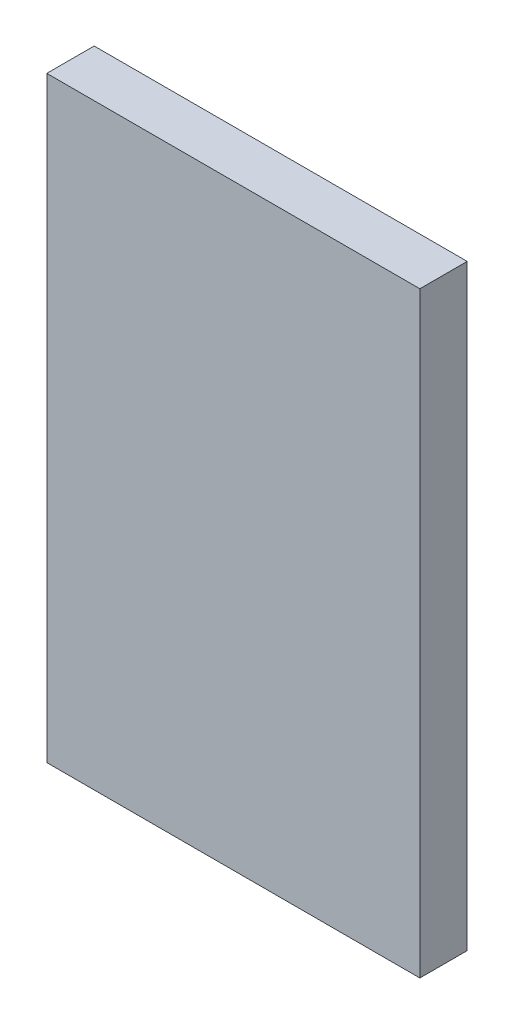
ISO-10303-21;
HEADER;
FILE_DESCRIPTION(('STEP AP214'),'2;1');
FILE_NAME('part.step','',(''),(''),'','','');
FILE_SCHEMA(('AUTOMOTIVE_DESIGN { 1 0 10303 214 1 1 1 1 }'));
ENDSEC;
DATA;
#1=APPLICATION_CONTEXT('core data for automotive mechanical design processes');
#2=APPLICATION_PROTOCOL_DEFINITION('international standard','automotive_design',2000,#1);
#3=PRODUCT_CONTEXT('',#1,'mechanical');
#4=PRODUCT('Part','Part','',(#3));
#5=PRODUCT_RELATED_PRODUCT_CATEGORY('part','',(#4));
#6=PRODUCT_DEFINITION_FORMATION('','',#4);
#7=PRODUCT_DEFINITION_CONTEXT('part definition',#1,'design');
#8=PRODUCT_DEFINITION('design','',#6,#7);
#9=PRODUCT_DEFINITION_SHAPE('','',#8);
#10=(LENGTH_UNIT() NAMED_UNIT(*) SI_UNIT(.MILLI.,.METRE.));
#11=(NAMED_UNIT(*) PLANE_ANGLE_UNIT() SI_UNIT($,.RADIAN.));
#12=(NAMED_UNIT(*) SI_UNIT($,.STERADIAN.) SOLID_ANGLE_UNIT());
#13=UNCERTAINTY_MEASURE_WITH_UNIT(LENGTH_MEASURE(1.E-05),#10,'distance_accuracy_value','');
#14=(GEOMETRIC_REPRESENTATION_CONTEXT(3) GLOBAL_UNCERTAINTY_ASSIGNED_CONTEXT((#13)) GLOBAL_UNIT_ASSIGNED_CONTEXT((#10,
#11,#12)) REPRESENTATION_CONTEXT('',''));
#15=CARTESIAN_POINT('',(0.,0.,0.));
#16=DIRECTION('',(0.,0.,1.));
#17=DIRECTION('',(1.,0.,0.));
#18=AXIS2_PLACEMENT_3D('',#15,#16,#17);
#19=CARTESIAN_POINT('',(25.,-40.,6.35));
#20=DIRECTION('',(-1.,0.,0.));
#21=DIRECTION('',(0.,-1.,0.));
#22=AXIS2_PLACEMENT_3D('',#19,#20,#21);
#23=PLANE('',#22);
#24=DIRECTION('',(0.,1.,0.));
#25=VECTOR('',#24,1.);
#26=CARTESIAN_POINT('',(25.,-40.,0.));
#27=LINE('',#26,#25);
#28=CARTESIAN_POINT('',(25.,-40.,0.));
#29=VERTEX_POINT('',#28);
#30=CARTESIAN_POINT('',(25.,40.,0.));
#31=VERTEX_POINT('',#30);
#32=EDGE_CURVE('E100',#29,#31,#27,.T.);
#33=ORIENTED_EDGE('',*,*,#32,.T.);
#34=DIRECTION('',(0.,0.,-1.));
#35=VECTOR('',#34,1.);
#36=CARTESIAN_POINT('',(25.,40.,6.35));
#37=LINE('',#36,#35);
#38=CARTESIAN_POINT('',(25.,40.,6.35));
#39=VERTEX_POINT('',#38);
#40=EDGE_CURVE('E11',#39,#31,#37,.T.);
#41=ORIENTED_EDGE('',*,*,#40,.F.);
#42=DIRECTION('',(0.,1.,0.));
#43=VECTOR('',#42,1.);
#44=CARTESIAN_POINT('',(25.,-40.,6.35));
#45=LINE('',#44,#43);
#46=CARTESIAN_POINT('',(25.,-40.,6.35));
#47=VERTEX_POINT('',#46);
#48=EDGE_CURVE('E88',#47,#39,#45,.T.);
#49=ORIENTED_EDGE('',*,*,#48,.F.);
#50=DIRECTION('',(0.,0.,-1.));
#51=VECTOR('',#50,1.);
#52=CARTESIAN_POINT('',(25.,-40.,6.35));
#53=LINE('',#52,#51);
#54=EDGE_CURVE('E96',#47,#29,#53,.T.);
#55=ORIENTED_EDGE('',*,*,#54,.T.);
#56=EDGE_LOOP('',(#33,#41,#49,#55));
#57=FACE_BOUND('',#56,.T.);
#58=ADVANCED_FACE('F37',(#57),#23,.F.);
#59=CARTESIAN_POINT('',(-25.,40.,6.35));
#60=DIRECTION('',(0.,-1.,0.));
#61=DIRECTION('',(0.,0.,-1.));
#62=AXIS2_PLACEMENT_3D('',#59,#60,#61);
#63=PLANE('',#62);
#64=DIRECTION('',(-1.,0.,0.));
#65=VECTOR('',#64,1.);
#66=CARTESIAN_POINT('',(-25.,40.,0.));
#67=LINE('',#66,#65);
#68=CARTESIAN_POINT('',(-25.,40.,0.));
#69=VERTEX_POINT('',#68);
#70=EDGE_CURVE('E92',#31,#69,#67,.T.);
#71=ORIENTED_EDGE('',*,*,#70,.T.);
#72=DIRECTION('',(0.,0.,-1.));
#73=VECTOR('',#72,1.);
#74=CARTESIAN_POINT('',(-25.,40.,6.35));
#75=LINE('',#74,#73);
#76=CARTESIAN_POINT('',(-25.,40.,6.35));
#77=VERTEX_POINT('',#76);
#78=EDGE_CURVE('E45',#77,#69,#75,.T.);
#79=ORIENTED_EDGE('',*,*,#78,.F.);
#80=DIRECTION('',(-1.,0.,0.));
#81=VECTOR('',#80,1.);
#82=CARTESIAN_POINT('',(-25.,40.,6.35));
#83=LINE('',#82,#81);
#84=EDGE_CURVE('E83',#39,#77,#83,.T.);
#85=ORIENTED_EDGE('',*,*,#84,.F.);
#86=ORIENTED_EDGE('',*,*,#40,.T.);
#87=EDGE_LOOP('',(#71,#79,#85,#86));
#88=FACE_BOUND('',#87,.T.);
#89=ADVANCED_FACE('F91',(#88),#63,.F.);
#90=CARTESIAN_POINT('',(-25.,-40.,6.35));
#91=DIRECTION('',(1.,0.,0.));
#92=DIRECTION('',(0.,1.,0.));
#93=AXIS2_PLACEMENT_3D('',#90,#91,#92);
#94=PLANE('',#93);
#95=DIRECTION('',(0.,-1.,0.));
#96=VECTOR('',#95,1.);
#97=CARTESIAN_POINT('',(-25.,-40.,0.));
#98=LINE('',#97,#96);
#99=CARTESIAN_POINT('',(-25.,-40.,0.));
#100=VERTEX_POINT('',#99);
#101=EDGE_CURVE('E70',#69,#100,#98,.T.);
#102=ORIENTED_EDGE('',*,*,#101,.T.);
#103=DIRECTION('',(0.,0.,-1.));
#104=VECTOR('',#103,1.);
#105=CARTESIAN_POINT('',(-25.,-40.,6.35));
#106=LINE('',#105,#104);
#107=CARTESIAN_POINT('',(-25.,-40.,6.35));
#108=VERTEX_POINT('',#107);
#109=EDGE_CURVE('E93',#108,#100,#106,.T.);
#110=ORIENTED_EDGE('',*,*,#109,.F.);
#111=DIRECTION('',(0.,-1.,0.));
#112=VECTOR('',#111,1.);
#113=CARTESIAN_POINT('',(-25.,-40.,6.35));
#114=LINE('',#113,#112);
#115=EDGE_CURVE('E86',#77,#108,#114,.T.);
#116=ORIENTED_EDGE('',*,*,#115,.F.);
#117=ORIENTED_EDGE('',*,*,#78,.T.);
#118=EDGE_LOOP('',(#102,#110,#116,#117));
#119=FACE_BOUND('',#118,.T.);
#120=ADVANCED_FACE('F94',(#119),#94,.F.);
#121=CARTESIAN_POINT('',(-25.,-40.,6.35));
#122=DIRECTION('',(0.,1.,0.));
#123=DIRECTION('',(0.,0.,1.));
#124=AXIS2_PLACEMENT_3D('',#121,#122,#123);
#125=PLANE('',#124);
#126=DIRECTION('',(1.,0.,0.));
#127=VECTOR('',#126,1.);
#128=CARTESIAN_POINT('',(-25.,-40.,0.));
#129=LINE('',#128,#127);
#130=EDGE_CURVE('E76',#100,#29,#129,.T.);
#131=ORIENTED_EDGE('',*,*,#130,.T.);
#132=ORIENTED_EDGE('',*,*,#54,.F.);
#133=DIRECTION('',(1.,0.,0.));
#134=VECTOR('',#133,1.);
#135=CARTESIAN_POINT('',(-25.,-40.,6.35));
#136=LINE('',#135,#134);
#137=EDGE_CURVE('E53',#108,#47,#136,.T.);
#138=ORIENTED_EDGE('',*,*,#137,.F.);
#139=ORIENTED_EDGE('',*,*,#109,.T.);
#140=EDGE_LOOP('',(#131,#132,#138,#139));
#141=FACE_BOUND('',#140,.T.);
#142=ADVANCED_FACE('F107',(#141),#125,.F.);
#143=CARTESIAN_POINT('',(0.,0.,6.35));
#144=DIRECTION('',(0.,0.,-1.));
#145=DIRECTION('',(-1.,0.,0.));
#146=AXIS2_PLACEMENT_3D('',#143,#144,#145);
#147=PLANE('',#146);
#148=ORIENTED_EDGE('',*,*,#48,.T.);
#149=ORIENTED_EDGE('',*,*,#84,.T.);
#150=ORIENTED_EDGE('',*,*,#115,.T.);
#151=ORIENTED_EDGE('',*,*,#137,.T.);
#152=EDGE_LOOP('',(#148,#149,#150,#151));
#153=FACE_BOUND('',#152,.T.);
#154=ADVANCED_FACE('F84',(#153),#147,.F.);
#155=CARTESIAN_POINT('',(0.,0.,0.));
#156=DIRECTION('',(0.,0.,-1.));
#157=DIRECTION('',(-1.,0.,0.));
#158=AXIS2_PLACEMENT_3D('',#155,#156,#157);
#159=PLANE('',#158);
#160=ORIENTED_EDGE('',*,*,#32,.F.);
#161=ORIENTED_EDGE('',*,*,#130,.F.);
#162=ORIENTED_EDGE('',*,*,#101,.F.);
#163=ORIENTED_EDGE('',*,*,#70,.F.);
#164=EDGE_LOOP('',(#160,#161,#162,#163));
#165=FACE_BOUND('',#164,.T.);
#166=ADVANCED_FACE('F110',(#165),#159,.T.);
#167=CLOSED_SHELL('',(#58,#89,#120,#142,#154,#166));
#168=MANIFOLD_SOLID_BREP('B2',#167);
#169=ADVANCED_BREP_SHAPE_REPRESENTATION('',(#18,#168),#14);
#170=SHAPE_DEFINITION_REPRESENTATION(#9,#169);
ENDSEC;
END-ISO-10303-21;
